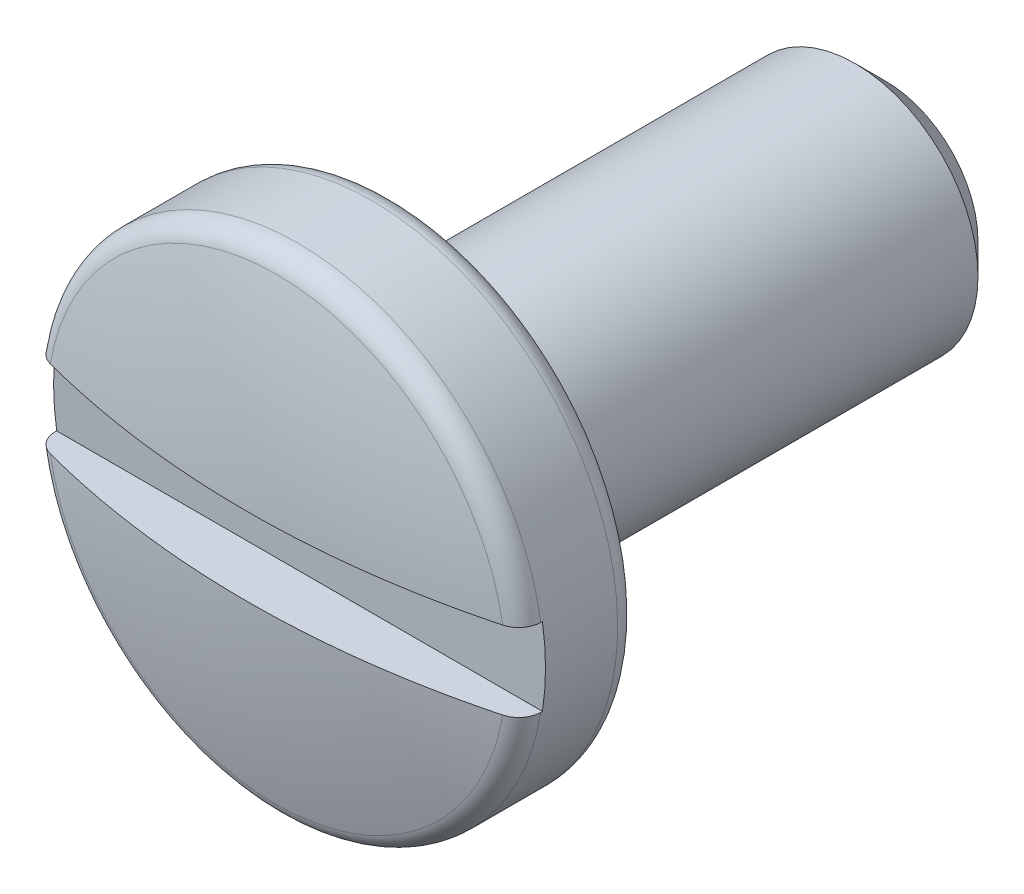
ISO-10303-21;
HEADER;
FILE_DESCRIPTION(('STEP AP214'),'2;1');
FILE_NAME('part.step','',(''),(''),'','','');
FILE_SCHEMA(('AUTOMOTIVE_DESIGN { 1 0 10303 214 1 1 1 1 }'));
ENDSEC;
DATA;
#1=APPLICATION_CONTEXT('core data for automotive mechanical design processes');
#2=APPLICATION_PROTOCOL_DEFINITION('international standard','automotive_design',2000,#1);
#3=PRODUCT_CONTEXT('',#1,'mechanical');
#4=PRODUCT('Part','Part','',(#3));
#5=PRODUCT_RELATED_PRODUCT_CATEGORY('part','',(#4));
#6=PRODUCT_DEFINITION_FORMATION('','',#4);
#7=PRODUCT_DEFINITION_CONTEXT('part definition',#1,'design');
#8=PRODUCT_DEFINITION('design','',#6,#7);
#9=PRODUCT_DEFINITION_SHAPE('','',#8);
#10=(LENGTH_UNIT() NAMED_UNIT(*) SI_UNIT(.MILLI.,.METRE.));
#11=(NAMED_UNIT(*) PLANE_ANGLE_UNIT() SI_UNIT($,.RADIAN.));
#12=(NAMED_UNIT(*) SI_UNIT($,.STERADIAN.) SOLID_ANGLE_UNIT());
#13=UNCERTAINTY_MEASURE_WITH_UNIT(LENGTH_MEASURE(1.E-05),#10,'distance_accuracy_value','');
#14=(GEOMETRIC_REPRESENTATION_CONTEXT(3) GLOBAL_UNCERTAINTY_ASSIGNED_CONTEXT((#13)) GLOBAL_UNIT_ASSIGNED_CONTEXT((#10,
#11,#12)) REPRESENTATION_CONTEXT('',''));
#15=CARTESIAN_POINT('',(0.,0.,0.));
#16=DIRECTION('',(0.,0.,1.));
#17=DIRECTION('',(1.,0.,0.));
#18=AXIS2_PLACEMENT_3D('',#15,#16,#17);
#19=CARTESIAN_POINT('',(0.,0.,-6.00250000000007));
#20=DIRECTION('',(0.,0.,1.));
#21=DIRECTION('',(0.,-1.,0.));
#22=AXIS2_PLACEMENT_3D('',#19,#20,#21);
#23=SPHERICAL_SURFACE('',#22,21.6025000000001);
#24=CARTESIAN_POINT('',(0.,0.,14.861540652819));
#25=DIRECTION('',(0.,0.,1.));
#26=DIRECTION('',(0.,-1.,0.));
#27=AXIS2_PLACEMENT_3D('',#24,#25,#26);
#28=CIRCLE('',#27,5.59998338278931);
#29=CARTESIAN_POINT('',(5.51881453643049,0.95,14.861540652819));
#30=VERTEX_POINT('',#29);
#31=CARTESIAN_POINT('',(-5.51881453643048,0.95,14.861540652819));
#32=VERTEX_POINT('',#31);
#33=EDGE_CURVE('E167',#30,#32,#28,.T.);
#34=ORIENTED_EDGE('',*,*,#33,.T.);
#35=CARTESIAN_POINT('',(0.,0.95,-6.00250000000007));
#36=DIRECTION('',(0.,-1.,0.));
#37=DIRECTION('',(0.,0.,-1.));
#38=AXIS2_PLACEMENT_3D('',#35,#36,#37);
#39=CIRCLE('',#38,21.5816011048764);
#40=EDGE_CURVE('E100',#32,#30,#39,.F.);
#41=ORIENTED_EDGE('',*,*,#40,.T.);
#42=EDGE_LOOP('',(#34,#41));
#43=FACE_BOUND('',#42,.T.);
#44=ADVANCED_FACE('F33',(#43),#23,.T.);
#45=CARTESIAN_POINT('',(0.,0.,14.34));
#46=DIRECTION('',(0.,0.,1.));
#47=DIRECTION('',(0.,-1.,0.));
#48=AXIS2_PLACEMENT_3D('',#45,#46,#47);
#49=TOROIDAL_SURFACE('',#48,5.46,0.540000000000001);
#50=CARTESIAN_POINT('',(0.,0.,14.34));
#51=DIRECTION('',(0.,0.,1.));
#52=DIRECTION('',(0.,-1.,0.));
#53=AXIS2_PLACEMENT_3D('',#50,#51,#52);
#54=CIRCLE('',#53,6.);
#55=CARTESIAN_POINT('',(5.92431430631427,0.95,14.34));
#56=VERTEX_POINT('',#55);
#57=CARTESIAN_POINT('',(-5.92431430631428,0.95,14.34));
#58=VERTEX_POINT('',#57);
#59=EDGE_CURVE('E168',#56,#58,#54,.T.);
#60=ORIENTED_EDGE('',*,*,#59,.T.);
#61=CARTESIAN_POINT('',(-5.91408286412616,0.95,14.4439628781724));
#62=CARTESIAN_POINT('',(-5.90820099303262,0.95,14.4735559619081));
#63=CARTESIAN_POINT('',(-5.89979982613832,0.95,14.5026716036783));
#64=CARTESIAN_POINT('',(-5.8782065755902,0.95,14.5590962525339));
#65=CARTESIAN_POINT('',(-5.86500844927302,0.95,14.5864029293704));
#66=CARTESIAN_POINT('',(-5.83423312672482,0.95,14.6383948618619));
#67=CARTESIAN_POINT('',(-5.81665980630227,0.95,14.6630824102392));
#68=CARTESIAN_POINT('',(-5.77765260619428,0.95,14.7091776283677));
#69=CARTESIAN_POINT('',(-5.75621962903431,0.95,14.7305860627317));
#70=CARTESIAN_POINT('',(-5.70992866520756,0.95,14.7697131225802));
#71=CARTESIAN_POINT('',(-5.68504535737676,0.95,14.7874017821034));
#72=CARTESIAN_POINT('',(-5.63269286804277,0.95,14.8184151157693));
#73=CARTESIAN_POINT('',(-5.60522341701303,0.95,14.8317393344025));
#74=CARTESIAN_POINT('',(-5.54808969919578,0.95,14.8538307575968));
#75=CARTESIAN_POINT('',(-5.5184011542488,0.95,14.8625351773436));
#76=CARTESIAN_POINT('',(-5.4579914035091,0.95,14.8748984498427));
#77=CARTESIAN_POINT('',(-5.4272701279018,0.95,14.8785569607765));
#78=CARTESIAN_POINT('',(-5.36529526973599,0.95,14.8807554342426));
#79=CARTESIAN_POINT('',(-5.3340396011594,0.95,14.8792368907672));
#80=CARTESIAN_POINT('',(-5.27222057901635,0.95,14.8709984356016));
#81=CARTESIAN_POINT('',(-5.2416572526272,0.95,14.8642783200911));
#82=CARTESIAN_POINT('',(-5.1819587754752,0.95,14.8457762849293));
#83=CARTESIAN_POINT('',(-5.15283025690264,0.95,14.8339729431793));
#84=CARTESIAN_POINT('',(-5.09698438114967,0.95,14.805614697295));
#85=CARTESIAN_POINT('',(-5.0702669899726,0.95,14.7890598601699));
#86=CARTESIAN_POINT('',(-5.02019106408889,0.95,14.7517603864982));
#87=CARTESIAN_POINT('',(-4.99681289206552,0.95,14.7310421301236));
#88=CARTESIAN_POINT('',(-4.95393276095446,0.95,14.6859204303722));
#89=CARTESIAN_POINT('',(-4.93443048835405,0.95,14.661517285339));
#90=CARTESIAN_POINT('',(-4.90018084305378,0.95,14.6101122701604));
#91=CARTESIAN_POINT('',(-4.88536552265442,0.95,14.5831556825057));
#92=CARTESIAN_POINT('',(-4.86056279684425,0.95,14.5271059276789));
#93=CARTESIAN_POINT('',(-4.8505748714092,0.95,14.4980129910311));
#94=CARTESIAN_POINT('',(-4.8358820737941,0.95,14.4390571359505));
#95=CARTESIAN_POINT('',(-4.83108890485606,0.95,14.4092162055842));
#96=CARTESIAN_POINT('',(-4.82663557671632,0.95,14.3491545309638));
#97=CARTESIAN_POINT('',(-4.82697505432434,0.95,14.3189338137349));
#98=CARTESIAN_POINT('',(-4.8327465883141,0.95,14.2592830478239));
#99=CARTESIAN_POINT('',(-4.83812878878605,0.95,14.2298481562619));
#100=CARTESIAN_POINT('',(-4.85374303707929,0.95,14.1722953960671));
#101=CARTESIAN_POINT('',(-4.86397509678908,0.95,14.1441775306628));
#102=CARTESIAN_POINT('',(-4.88901291697735,0.95,14.0899465312197));
#103=CARTESIAN_POINT('',(-4.90383371682446,0.95,14.0638403469928));
#104=CARTESIAN_POINT('',(-4.93758916249785,0.95,14.0144402874773));
#105=CARTESIAN_POINT('',(-4.95652407720675,0.95,13.9911465961573));
#106=CARTESIAN_POINT('',(-4.99825261015565,0.95,13.9476717167146));
#107=CARTESIAN_POINT('',(-5.0210974645698,0.95,13.9275397195313));
#108=CARTESIAN_POINT('',(-5.06979338632466,0.95,13.8913179656327));
#109=CARTESIAN_POINT('',(-5.09564472894964,0.95,13.8752285794995));
#110=CARTESIAN_POINT('',(-5.1501014615364,0.95,13.8472601379013));
#111=CARTESIAN_POINT('',(-5.17874680273083,0.95,13.8354588474951));
#112=CARTESIAN_POINT('',(-5.2375978308741,0.95,13.8167684193339));
#113=CARTESIAN_POINT('',(-5.26780363053907,0.95,13.809879636956));
#114=CARTESIAN_POINT('',(-5.32930286894649,0.95,13.8011435424912));
#115=CARTESIAN_POINT('',(-5.36060496048082,0.95,13.7993570210726));
#116=CARTESIAN_POINT('',(-5.42306698938116,0.95,13.8010535073426));
#117=CARTESIAN_POINT('',(-5.45422692295463,0.95,13.804536654803));
#118=CARTESIAN_POINT('',(-5.51557345643747,0.95,13.8167014190185));
#119=CARTESIAN_POINT('',(-5.54575825113229,0.95,13.8253921533435));
#120=CARTESIAN_POINT('',(-5.60422269400551,0.95,13.8477569869247));
#121=CARTESIAN_POINT('',(-5.63250239796535,0.95,13.861430940196));
#122=CARTESIAN_POINT('',(-5.68611244563843,0.95,13.8932719762133));
#123=CARTESIAN_POINT('',(-5.7114639300382,0.95,13.911403450211));
#124=CARTESIAN_POINT('',(-5.75871098077637,0.95,13.9517161501393));
#125=CARTESIAN_POINT('',(-5.78060691632715,0.95,13.9738969428685));
#126=CARTESIAN_POINT('',(-5.82001681999505,0.95,14.0213700398175));
#127=CARTESIAN_POINT('',(-5.83758418847429,0.95,14.0466180149942));
#128=CARTESIAN_POINT('',(-5.86817152106584,0.95,14.099742420399));
#129=CARTESIAN_POINT('',(-5.88119065975126,0.95,14.127619326569));
#130=CARTESIAN_POINT('',(-5.90214457522207,0.95,14.1848356566686));
#131=CARTESIAN_POINT('',(-5.91013905899079,0.95,14.2141532612866));
#132=CARTESIAN_POINT('',(-5.92103777836602,0.95,14.2736938653031));
#133=CARTESIAN_POINT('',(-5.92394856695173,0.95,14.3039156479816));
#134=CARTESIAN_POINT('',(-5.92448539799561,0.95,14.3525621580073));
#135=CARTESIAN_POINT('',(-5.92373161691234,0.95,14.3709837356399));
#136=CARTESIAN_POINT('',(-5.9203258485621,0.95,14.4076504875292));
#137=CARTESIAN_POINT('',(-5.9176738731696,0.95,14.4258956628888));
#138=CARTESIAN_POINT('',(-5.91408286412616,0.95,14.4439628781724));
#139=B_SPLINE_CURVE_WITH_KNOTS('',3,(#61,#62,#63,#64,#65,#66,#67,#68,#69,#70,#71,#72,#73,#74,
#75,#76,#77,#78,#79,#80,#81,#82,#83,#84,#85,#86,#87,#88,#89,#90,#91,#92,#93,#94,#95,#96,#97,#98,
#99,#100,#101,#102,#103,#104,#105,#106,#107,#108,#109,#110,#111,#112,#113,#114,#115,#116,#117,
#118,#119,#120,#121,#122,#123,#124,#125,#126,#127,#128,#129,#130,#131,#132,#133,#134,#135,#136,
#137,#138),.UNSPECIFIED.,.T.,.F.,(4,2,2,2,2,2,2,2,2,2,2,2,2,2,2,2,2,2,2,2,2,2,2,2,2,2,2,2,2,2,2,
2,2,2,2,2,2,2,4),(0.,0.0904478792539783,0.181010091588253,0.271492362188787,0.36195350221476,
0.453117607544997,0.544291224492355,0.636674101462678,0.729063236301224,0.822499907634658,
0.915940240413774,1.00977826991165,1.10361497609572,1.19687486931934,1.29012721588842,
1.38195811481368,1.47377911918018,1.56401368017409,1.65424185612642,1.74358728168259,
1.83293292625282,1.92257455320903,2.01222204055844,2.10314956069556,2.19408541302963,
2.28659657185072,2.37911442237007,2.4727300653122,2.56634819134221,2.66013070715836,
2.75391047580851,2.84696413486097,2.94000784473918,3.03183868635747,3.12368618507576,
3.21442055074415,3.3050378715385,3.36025859620656,3.4154789754354),.UNSPECIFIED.);
#140=EDGE_CURVE('E90',#58,#32,#139,.T.);
#141=ORIENTED_EDGE('',*,*,#140,.T.);
#142=ORIENTED_EDGE('',*,*,#33,.F.);
#143=CARTESIAN_POINT('',(4.83682440513329,0.95,14.4394478551972));
#144=CARTESIAN_POINT('',(4.84247640495268,0.95,14.4690397947303));
#145=CARTESIAN_POINT('',(4.85065773668445,0.95,14.4981723132612));
#146=CARTESIAN_POINT('',(4.87182544709717,0.95,14.5546636895985));
#147=CARTESIAN_POINT('',(4.88481809030107,0.95,14.5820201801213));
#148=CARTESIAN_POINT('',(4.91518464569733,0.95,14.6341421336857));
#149=CARTESIAN_POINT('',(4.9325536263659,0.95,14.658910469068));
#150=CARTESIAN_POINT('',(4.97115203822448,0.95,14.7052157356956));
#151=CARTESIAN_POINT('',(4.99238062016714,0.95,14.7267533759081));
#152=CARTESIAN_POINT('',(5.03836062806902,0.95,14.7662808174436));
#153=CARTESIAN_POINT('',(5.06315103037017,0.95,14.7842252678716));
#154=CARTESIAN_POINT('',(5.11535358683606,0.95,14.8157784710163));
#155=CARTESIAN_POINT('',(5.14276606827431,0.95,14.8293866815867));
#156=CARTESIAN_POINT('',(5.1999218862093,0.95,14.8521070615309));
#157=CARTESIAN_POINT('',(5.2296962658606,0.95,14.8611411779848));
#158=CARTESIAN_POINT('',(5.29033308252579,0.95,14.8741340221093));
#159=CARTESIAN_POINT('',(5.32119558621155,0.95,14.8780924382228));
#160=CARTESIAN_POINT('',(5.38343541099762,0.95,14.8808378254908));
#161=CARTESIAN_POINT('',(5.41481485688069,0.95,14.8795769505175));
#162=CARTESIAN_POINT('',(5.47691636321346,0.95,14.8717990215925));
#163=CARTESIAN_POINT('',(5.50763842004573,0.95,14.8652819387249));
#164=CARTESIAN_POINT('',(5.56750499330759,0.95,14.8471664000118));
#165=CARTESIAN_POINT('',(5.59665145907805,0.95,14.8355743924385));
#166=CARTESIAN_POINT('',(5.65255697421994,0.95,14.8076144350991));
#167=CARTESIAN_POINT('',(5.6793161260906,0.95,14.7912466905082));
#168=CARTESIAN_POINT('',(5.72940067596725,0.95,14.7543638564202));
#169=CARTESIAN_POINT('',(5.752757165969,0.95,14.7338909999974));
#170=CARTESIAN_POINT('',(5.79564355464877,0.95,14.6892668427131));
#171=CARTESIAN_POINT('',(5.81517373236117,0.95,14.6651158103117));
#172=CARTESIAN_POINT('',(5.84957544407563,0.95,14.6141680689685));
#173=CARTESIAN_POINT('',(5.86450584333343,0.95,14.5874111058719));
#174=CARTESIAN_POINT('',(5.88960166131369,0.95,14.5317487363972));
#175=CARTESIAN_POINT('',(5.89976741183367,0.95,14.502843479783));
#176=CARTESIAN_POINT('',(5.9149306494783,0.95,14.4440659967135));
#177=CARTESIAN_POINT('',(5.91998668663484,0.95,14.4142088653396));
#178=CARTESIAN_POINT('',(5.92498174995559,0.95,14.3540700155856));
#179=CARTESIAN_POINT('',(5.92492099455564,0.95,14.3237883153856));
#180=CARTESIAN_POINT('',(5.91970016802833,0.95,14.2638469794583));
#181=CARTESIAN_POINT('',(5.91456986751707,0.95,14.2341847442534));
#182=CARTESIAN_POINT('',(5.8994098993757,0.95,14.1761407131891));
#183=CARTESIAN_POINT('',(5.88938024963987,0.95,14.1477589126534));
#184=CARTESIAN_POINT('',(5.86470169496997,0.95,14.0930245555649));
#185=CARTESIAN_POINT('',(5.8500451453356,0.95,14.0666754477915));
#186=CARTESIAN_POINT('',(5.81655205453034,0.95,14.0167844847025));
#187=CARTESIAN_POINT('',(5.7977153690247,0.95,13.9932427263641));
#188=CARTESIAN_POINT('',(5.75623097598951,0.95,13.9494125612447));
#189=CARTESIAN_POINT('',(5.73355197836509,0.95,13.9291537784371));
#190=CARTESIAN_POINT('',(5.68515161899892,0.95,13.8926739200537));
#191=CARTESIAN_POINT('',(5.6594300660855,0.95,13.8764530983927));
#192=CARTESIAN_POINT('',(5.60532446141866,0.95,13.8482877360382));
#193=CARTESIAN_POINT('',(5.57691058866195,0.95,13.836400484607));
#194=CARTESIAN_POINT('',(5.51850622385522,0.95,13.8174980950864));
#195=CARTESIAN_POINT('',(5.4885156213502,0.95,13.8104832988186));
#196=CARTESIAN_POINT('',(5.42740580800129,0.95,13.8014406002523));
#197=CARTESIAN_POINT('',(5.39627714955243,0.95,13.7994764869019));
#198=CARTESIAN_POINT('',(5.33412693431079,0.95,13.8007616903196));
#199=CARTESIAN_POINT('',(5.3031053836171,0.95,13.8040112992239));
#200=CARTESIAN_POINT('',(5.24181820260555,0.95,13.8156756410718));
#201=CARTESIAN_POINT('',(5.21155954250446,0.95,13.8241270509503));
#202=CARTESIAN_POINT('',(5.15289466666525,0.95,13.8460018099041));
#203=CARTESIAN_POINT('',(5.12448846488054,0.95,13.8594251964252));
#204=CARTESIAN_POINT('',(5.07042388430418,0.95,13.8908463229353));
#205=CARTESIAN_POINT('',(5.04475876028335,0.95,13.9088324483385));
#206=CARTESIAN_POINT('',(4.99686243676178,0.95,13.948908901845));
#207=CARTESIAN_POINT('',(4.97463089574783,0.95,13.9709988212919));
#208=CARTESIAN_POINT('',(4.93454759286052,0.95,14.0183613870703));
#209=CARTESIAN_POINT('',(4.91664327951233,0.95,14.0435895446884));
#210=CARTESIAN_POINT('',(4.88540928894486,0.95,14.0967446176961));
#211=CARTESIAN_POINT('',(4.87208030486004,0.95,14.1246719411722));
#212=CARTESIAN_POINT('',(4.85062218682697,0.95,14.1819070861569));
#213=CARTESIAN_POINT('',(4.842407712262,0.95,14.2111829768688));
#214=CARTESIAN_POINT('',(4.83109636184015,0.95,14.2706807910826));
#215=CARTESIAN_POINT('',(4.82799262241727,0.95,14.3009013901637));
#216=CARTESIAN_POINT('',(4.82718087398153,0.95,14.3492945017202));
#217=CARTESIAN_POINT('',(4.82781207376359,0.95,14.3674547074061));
#218=CARTESIAN_POINT('',(4.83093080938027,0.95,14.4036148413034));
#219=CARTESIAN_POINT('',(4.83341832267764,0.95,14.4216147714581));
#220=CARTESIAN_POINT('',(4.83682440513329,0.95,14.4394478551972));
#221=B_SPLINE_CURVE_WITH_KNOTS('',3,(#143,#144,#145,#146,#147,#148,#149,#150,#151,#152,#153,
#154,#155,#156,#157,#158,#159,#160,#161,#162,#163,#164,#165,#166,#167,#168,#169,#170,#171,#172,
#173,#174,#175,#176,#177,#178,#179,#180,#181,#182,#183,#184,#185,#186,#187,#188,#189,#190,#191,
#192,#193,#194,#195,#196,#197,#198,#199,#200,#201,#202,#203,#204,#205,#206,#207,#208,#209,#210,
#211,#212,#213,#214,#215,#216,#217,#218,#219,#220),.UNSPECIFIED.,.T.,.F.,(4,2,2,2,2,2,2,2,2,2,2,
2,2,2,2,2,2,2,2,2,2,2,2,2,2,2,2,2,2,2,2,2,2,2,2,2,2,2,4),(0.,0.0903131250714283,
0.180744257346397,0.27107393852658,0.36138376801719,0.452770100675054,0.544167854594141,
0.637076691301503,0.729991230676079,0.823759410804649,0.917528106781145,1.01117800313762,
1.10482387670278,1.19755166157004,1.29027268173086,1.38175244491998,1.47322583675384,
1.56363876629347,1.65404783610758,1.74392912010497,1.83381007582467,1.92384031966508,
2.01387367261838,2.10467894939972,2.19548993474665,2.28746127290161,2.37943906255185,
2.47257292962511,2.56571201537504,2.65951545211125,2.75331959532831,2.8468873122732,
2.94044571672532,3.03280331448307,3.1251748976848,3.21596068104943,3.30662444205956,
3.36105078589094,3.4154764689502),.UNSPECIFIED.);
#222=EDGE_CURVE('E183',#30,#56,#221,.T.);
#223=ORIENTED_EDGE('',*,*,#222,.T.);
#224=EDGE_LOOP('',(#60,#141,#142,#223));
#225=FACE_BOUND('',#224,.T.);
#226=ADVANCED_FACE('F145',(#225),#49,.T.);
#227=CARTESIAN_POINT('',(0.,0.,12.));
#228=DIRECTION('',(0.,0.,-1.));
#229=DIRECTION('',(-1.,0.,0.));
#230=AXIS2_PLACEMENT_3D('',#227,#228,#229);
#231=PLANE('',#230);
#232=CARTESIAN_POINT('',(0.,0.,12.));
#233=DIRECTION('',(0.,0.,1.));
#234=DIRECTION('',(1.,0.,0.));
#235=AXIS2_PLACEMENT_3D('',#232,#233,#234);
#236=CIRCLE('',#235,3.);
#237=CARTESIAN_POINT('',(3.,0.,12.));
#238=VERTEX_POINT('',#237);
#239=EDGE_CURVE('E170',#238,#238,#236,.T.);
#240=ORIENTED_EDGE('',*,*,#239,.T.);
#241=EDGE_LOOP('',(#240));
#242=FACE_BOUND('',#241,.T.);
#243=CARTESIAN_POINT('',(0.,0.,12.));
#244=DIRECTION('',(0.,0.,1.));
#245=DIRECTION('',(0.,-1.,0.));
#246=AXIS2_PLACEMENT_3D('',#243,#244,#245);
#247=CIRCLE('',#246,5.46);
#248=CARTESIAN_POINT('',(0.,-5.46,12.));
#249=VERTEX_POINT('',#248);
#250=EDGE_CURVE('E199',#249,#249,#247,.T.);
#251=ORIENTED_EDGE('',*,*,#250,.F.);
#252=EDGE_LOOP('',(#251));
#253=FACE_BOUND('',#252,.T.);
#254=ADVANCED_FACE('F150',(#242,#253),#231,.T.);
#255=CARTESIAN_POINT('',(0.,0.,0.));
#256=DIRECTION('',(0.,0.,1.));
#257=DIRECTION('',(1.,0.,0.));
#258=AXIS2_PLACEMENT_3D('',#255,#256,#257);
#259=PLANE('',#258);
#260=CARTESIAN_POINT('',(0.,0.,0.));
#261=DIRECTION('',(0.,0.,1.));
#262=DIRECTION('',(1.,0.,0.));
#263=AXIS2_PLACEMENT_3D('',#260,#261,#262);
#264=CIRCLE('',#263,2.25);
#265=CARTESIAN_POINT('',(2.25,0.,0.));
#266=VERTEX_POINT('',#265);
#267=EDGE_CURVE('E180',#266,#266,#264,.F.);
#268=ORIENTED_EDGE('',*,*,#267,.T.);
#269=EDGE_LOOP('',(#268));
#270=FACE_BOUND('',#269,.T.);
#271=ADVANCED_FACE('F206',(#270),#259,.F.);
#272=CARTESIAN_POINT('',(0.,0.,0.));
#273=DIRECTION('',(0.,0.,1.));
#274=DIRECTION('',(1.,0.,0.));
#275=AXIS2_PLACEMENT_3D('',#272,#273,#274);
#276=CYLINDRICAL_SURFACE('',#275,3.);
#277=CARTESIAN_POINT('',(0.,0.,0.749999999999997));
#278=DIRECTION('',(0.,0.,1.));
#279=DIRECTION('',(1.,0.,0.));
#280=AXIS2_PLACEMENT_3D('',#277,#278,#279);
#281=CIRCLE('',#280,3.);
#282=CARTESIAN_POINT('',(3.,0.,0.749999999999997));
#283=VERTEX_POINT('',#282);
#284=EDGE_CURVE('E177',#283,#283,#281,.T.);
#285=ORIENTED_EDGE('',*,*,#284,.T.);
#286=EDGE_LOOP('',(#285));
#287=FACE_BOUND('',#286,.T.);
#288=ORIENTED_EDGE('',*,*,#239,.F.);
#289=EDGE_LOOP('',(#288));
#290=FACE_BOUND('',#289,.T.);
#291=ADVANCED_FACE('F140',(#287,#290),#276,.T.);
#292=CARTESIAN_POINT('',(0.,0.,0.749999999999997));
#293=DIRECTION('',(0.,0.,1.));
#294=DIRECTION('',(1.,0.,0.));
#295=AXIS2_PLACEMENT_3D('',#292,#293,#294);
#296=CONICAL_SURFACE('',#295,3.,0.785398163397451);
#297=ORIENTED_EDGE('',*,*,#267,.F.);
#298=EDGE_LOOP('',(#297));
#299=FACE_BOUND('',#298,.T.);
#300=ORIENTED_EDGE('',*,*,#284,.F.);
#301=EDGE_LOOP('',(#300));
#302=FACE_BOUND('',#301,.T.);
#303=ADVANCED_FACE('F35',(#299,#302),#296,.T.);
#304=CARTESIAN_POINT('',(0.,0.,12.54));
#305=DIRECTION('',(0.,0.,1.));
#306=DIRECTION('',(0.,-1.,0.));
#307=AXIS2_PLACEMENT_3D('',#304,#305,#306);
#308=TOROIDAL_SURFACE('',#307,5.46,0.540000000000001);
#309=ORIENTED_EDGE('',*,*,#250,.T.);
#310=EDGE_LOOP('',(#309));
#311=FACE_BOUND('',#310,.T.);
#312=CARTESIAN_POINT('',(0.,0.,12.54));
#313=DIRECTION('',(0.,0.,1.));
#314=DIRECTION('',(0.,-1.,0.));
#315=AXIS2_PLACEMENT_3D('',#312,#313,#314);
#316=CIRCLE('',#315,6.);
#317=CARTESIAN_POINT('',(0.,-6.,12.54));
#318=VERTEX_POINT('',#317);
#319=EDGE_CURVE('E200',#318,#318,#316,.T.);
#320=ORIENTED_EDGE('',*,*,#319,.F.);
#321=EDGE_LOOP('',(#320));
#322=FACE_BOUND('',#321,.T.);
#323=ADVANCED_FACE('F130',(#311,#322),#308,.T.);
#324=CARTESIAN_POINT('',(0.,0.,0.));
#325=DIRECTION('',(0.,0.,-1.));
#326=DIRECTION('',(-1.,0.,0.));
#327=AXIS2_PLACEMENT_3D('',#324,#325,#326);
#328=CYLINDRICAL_SURFACE('',#327,6.);
#329=DIRECTION('',(0.,0.,-1.));
#330=VECTOR('',#329,1.);
#331=CARTESIAN_POINT('',(5.92431430631427,-0.95,0.));
#332=LINE('',#331,#330);
#333=CARTESIAN_POINT('',(5.92431430631467,-0.95,14.34));
#334=VERTEX_POINT('',#333);
#335=CARTESIAN_POINT('',(5.92431430631427,-0.95,14.3));
#336=VERTEX_POINT('',#335);
#337=EDGE_CURVE('E164',#334,#336,#332,.T.);
#338=ORIENTED_EDGE('',*,*,#337,.F.);
#339=CARTESIAN_POINT('',(-5.92431430631428,-0.95,14.34));
#340=VERTEX_POINT('',#339);
#341=EDGE_CURVE('E171',#340,#334,#54,.T.);
#342=ORIENTED_EDGE('',*,*,#341,.F.);
#343=DIRECTION('',(0.,0.,-1.));
#344=VECTOR('',#343,1.);
#345=CARTESIAN_POINT('',(-5.92431430631427,-0.95,0.));
#346=LINE('',#345,#344);
#347=CARTESIAN_POINT('',(-5.92431430631427,-0.95,14.3));
#348=VERTEX_POINT('',#347);
#349=EDGE_CURVE('E56',#348,#340,#346,.F.);
#350=ORIENTED_EDGE('',*,*,#349,.F.);
#351=CARTESIAN_POINT('',(0.,0.,14.3));
#352=DIRECTION('',(0.,0.,-1.));
#353=DIRECTION('',(-1.,0.,0.));
#354=AXIS2_PLACEMENT_3D('',#351,#352,#353);
#355=CIRCLE('',#354,6.);
#356=CARTESIAN_POINT('',(-5.92431430631427,0.95,14.3));
#357=VERTEX_POINT('',#356);
#358=EDGE_CURVE('E37',#357,#348,#355,.F.);
#359=ORIENTED_EDGE('',*,*,#358,.F.);
#360=DIRECTION('',(0.,0.,-1.));
#361=VECTOR('',#360,1.);
#362=CARTESIAN_POINT('',(-5.92431430631427,0.95,0.));
#363=LINE('',#362,#361);
#364=EDGE_CURVE('E85',#357,#58,#363,.F.);
#365=ORIENTED_EDGE('',*,*,#364,.T.);
#366=ORIENTED_EDGE('',*,*,#59,.F.);
#367=DIRECTION('',(0.,0.,-1.));
#368=VECTOR('',#367,1.);
#369=CARTESIAN_POINT('',(5.92431430631427,0.95,0.));
#370=LINE('',#369,#368);
#371=CARTESIAN_POINT('',(5.92431430631427,0.95,14.3));
#372=VERTEX_POINT('',#371);
#373=EDGE_CURVE('E48',#56,#372,#370,.T.);
#374=ORIENTED_EDGE('',*,*,#373,.T.);
#375=EDGE_CURVE('E11',#336,#372,#355,.F.);
#376=ORIENTED_EDGE('',*,*,#375,.F.);
#377=EDGE_LOOP('',(#338,#342,#350,#359,#365,#366,#374,#376));
#378=FACE_BOUND('',#377,.T.);
#379=ORIENTED_EDGE('',*,*,#319,.T.);
#380=EDGE_LOOP('',(#379));
#381=FACE_BOUND('',#380,.T.);
#382=ADVANCED_FACE('F104',(#378,#381),#328,.T.);
#383=CARTESIAN_POINT('',(0.,-0.95,-6.00250000000007));
#384=DIRECTION('',(0.,-1.,0.));
#385=DIRECTION('',(0.,0.,-1.));
#386=AXIS2_PLACEMENT_3D('',#383,#384,#385);
#387=CIRCLE('',#386,21.5816011048764);
#388=CARTESIAN_POINT('',(-5.51881453643048,-0.95,14.861540652819));
#389=VERTEX_POINT('',#388);
#390=CARTESIAN_POINT('',(5.51881453643049,-0.95,14.861540652819));
#391=VERTEX_POINT('',#390);
#392=EDGE_CURVE('E95',#389,#391,#387,.F.);
#393=ORIENTED_EDGE('',*,*,#392,.F.);
#394=EDGE_CURVE('E162',#389,#391,#28,.T.);
#395=ORIENTED_EDGE('',*,*,#394,.T.);
#396=EDGE_LOOP('',(#393,#395));
#397=FACE_BOUND('',#396,.T.);
#398=ADVANCED_FACE('F138',(#397),#23,.T.);
#399=CARTESIAN_POINT('',(-5.91408286412616,-0.95,14.4439628781724));
#400=CARTESIAN_POINT('',(-5.90820099303262,-0.95,14.4735559619081));
#401=CARTESIAN_POINT('',(-5.89979982613832,-0.95,14.5026716036783));
#402=CARTESIAN_POINT('',(-5.8782065755902,-0.95,14.5590962525339));
#403=CARTESIAN_POINT('',(-5.86500844927302,-0.95,14.5864029293704));
#404=CARTESIAN_POINT('',(-5.83423312672482,-0.95,14.6383948618619));
#405=CARTESIAN_POINT('',(-5.81665980630227,-0.95,14.6630824102392));
#406=CARTESIAN_POINT('',(-5.77765260619428,-0.95,14.7091776283677));
#407=CARTESIAN_POINT('',(-5.75621962903431,-0.95,14.7305860627317));
#408=CARTESIAN_POINT('',(-5.70992866520756,-0.95,14.7697131225802));
#409=CARTESIAN_POINT('',(-5.68504535737676,-0.95,14.7874017821034));
#410=CARTESIAN_POINT('',(-5.63269286804277,-0.95,14.8184151157693));
#411=CARTESIAN_POINT('',(-5.60522341701304,-0.95,14.8317393344025));
#412=CARTESIAN_POINT('',(-5.54808969919578,-0.95,14.8538307575968));
#413=CARTESIAN_POINT('',(-5.5184011542488,-0.95,14.8625351773436));
#414=CARTESIAN_POINT('',(-5.4579914035091,-0.95,14.8748984498427));
#415=CARTESIAN_POINT('',(-5.42727012790181,-0.95,14.8785569607765));
#416=CARTESIAN_POINT('',(-5.365295269736,-0.95,14.8807554342426));
#417=CARTESIAN_POINT('',(-5.3340396011594,-0.95,14.8792368907672));
#418=CARTESIAN_POINT('',(-5.27222057901635,-0.95,14.8709984356016));
#419=CARTESIAN_POINT('',(-5.2416572526272,-0.95,14.8642783200911));
#420=CARTESIAN_POINT('',(-5.1819587754752,-0.95,14.8457762849293));
#421=CARTESIAN_POINT('',(-5.15283025690264,-0.95,14.8339729431793));
#422=CARTESIAN_POINT('',(-5.09698438114967,-0.95,14.805614697295));
#423=CARTESIAN_POINT('',(-5.0702669899726,-0.95,14.7890598601699));
#424=CARTESIAN_POINT('',(-5.02019106408889,-0.95,14.7517603864982));
#425=CARTESIAN_POINT('',(-4.99681289206552,-0.95,14.7310421301236));
#426=CARTESIAN_POINT('',(-4.95393276095446,-0.95,14.6859204303722));
#427=CARTESIAN_POINT('',(-4.93443048835405,-0.95,14.661517285339));
#428=CARTESIAN_POINT('',(-4.90018084305378,-0.95,14.6101122701604));
#429=CARTESIAN_POINT('',(-4.88536552265442,-0.95,14.5831556825057));
#430=CARTESIAN_POINT('',(-4.86056279684425,-0.95,14.5271059276789));
#431=CARTESIAN_POINT('',(-4.8505748714092,-0.95,14.4980129910312));
#432=CARTESIAN_POINT('',(-4.8358820737941,-0.95,14.4390571359505));
#433=CARTESIAN_POINT('',(-4.83108890485606,-0.95,14.4092162055842));
#434=CARTESIAN_POINT('',(-4.82663557671632,-0.95,14.3491545309638));
#435=CARTESIAN_POINT('',(-4.82697505432434,-0.95,14.3189338137349));
#436=CARTESIAN_POINT('',(-4.8327465883141,-0.95,14.2592830478239));
#437=CARTESIAN_POINT('',(-4.83812878878605,-0.95,14.2298481562619));
#438=CARTESIAN_POINT('',(-4.85374303707929,-0.95,14.1722953960671));
#439=CARTESIAN_POINT('',(-4.86397509678908,-0.95,14.1441775306628));
#440=CARTESIAN_POINT('',(-4.88901291697735,-0.95,14.0899465312197));
#441=CARTESIAN_POINT('',(-4.90383371682447,-0.95,14.0638403469928));
#442=CARTESIAN_POINT('',(-4.93758916249785,-0.95,14.0144402874773));
#443=CARTESIAN_POINT('',(-4.95652407720676,-0.95,13.9911465961573));
#444=CARTESIAN_POINT('',(-4.99825261015565,-0.95,13.9476717167146));
#445=CARTESIAN_POINT('',(-5.0210974645698,-0.95,13.9275397195313));
#446=CARTESIAN_POINT('',(-5.06979338632466,-0.95,13.8913179656327));
#447=CARTESIAN_POINT('',(-5.09564472894964,-0.95,13.8752285794995));
#448=CARTESIAN_POINT('',(-5.1501014615364,-0.95,13.8472601379013));
#449=CARTESIAN_POINT('',(-5.17874680273083,-0.95,13.8354588474951));
#450=CARTESIAN_POINT('',(-5.2375978308741,-0.95,13.8167684193339));
#451=CARTESIAN_POINT('',(-5.26780363053907,-0.95,13.809879636956));
#452=CARTESIAN_POINT('',(-5.32930286894649,-0.95,13.8011435424912));
#453=CARTESIAN_POINT('',(-5.36060496048082,-0.95,13.7993570210726));
#454=CARTESIAN_POINT('',(-5.42306698938116,-0.95,13.8010535073426));
#455=CARTESIAN_POINT('',(-5.45422692295463,-0.95,13.804536654803));
#456=CARTESIAN_POINT('',(-5.51557345643747,-0.95,13.8167014190185));
#457=CARTESIAN_POINT('',(-5.54575825113229,-0.95,13.8253921533435));
#458=CARTESIAN_POINT('',(-5.6042226940055,-0.95,13.8477569869247));
#459=CARTESIAN_POINT('',(-5.63250239796535,-0.95,13.861430940196));
#460=CARTESIAN_POINT('',(-5.68611244563843,-0.95,13.8932719762133));
#461=CARTESIAN_POINT('',(-5.7114639300382,-0.95,13.911403450211));
#462=CARTESIAN_POINT('',(-5.75871098077637,-0.95,13.9517161501393));
#463=CARTESIAN_POINT('',(-5.78060691632715,-0.95,13.9738969428685));
#464=CARTESIAN_POINT('',(-5.82001681999505,-0.95,14.0213700398175));
#465=CARTESIAN_POINT('',(-5.83758418847428,-0.95,14.0466180149942));
#466=CARTESIAN_POINT('',(-5.86817152106584,-0.95,14.099742420399));
#467=CARTESIAN_POINT('',(-5.88119065975125,-0.95,14.127619326569));
#468=CARTESIAN_POINT('',(-5.90214457522207,-0.95,14.1848356566686));
#469=CARTESIAN_POINT('',(-5.91013905899079,-0.95,14.2141532612866));
#470=CARTESIAN_POINT('',(-5.92103777836602,-0.95,14.2736938653031));
#471=CARTESIAN_POINT('',(-5.92394856695173,-0.95,14.3039156479816));
#472=CARTESIAN_POINT('',(-5.92448539799561,-0.95,14.3525621580073));
#473=CARTESIAN_POINT('',(-5.92373161691234,-0.95,14.3709837356399));
#474=CARTESIAN_POINT('',(-5.9203258485621,-0.95,14.4076504875292));
#475=CARTESIAN_POINT('',(-5.9176738731696,-0.95,14.4258956628888));
#476=CARTESIAN_POINT('',(-5.91408286412616,-0.95,14.4439628781724));
#477=B_SPLINE_CURVE_WITH_KNOTS('',3,(#399,#400,#401,#402,#403,#404,#405,#406,#407,#408,#409,
#410,#411,#412,#413,#414,#415,#416,#417,#418,#419,#420,#421,#422,#423,#424,#425,#426,#427,#428,
#429,#430,#431,#432,#433,#434,#435,#436,#437,#438,#439,#440,#441,#442,#443,#444,#445,#446,#447,
#448,#449,#450,#451,#452,#453,#454,#455,#456,#457,#458,#459,#460,#461,#462,#463,#464,#465,#466,
#467,#468,#469,#470,#471,#472,#473,#474,#475,#476),.UNSPECIFIED.,.T.,.F.,(4,2,2,2,2,2,2,2,2,2,2,
2,2,2,2,2,2,2,2,2,2,2,2,2,2,2,2,2,2,2,2,2,2,2,2,2,2,2,4),(0.,0.0904478792539783,
0.181010091588253,0.271492362188785,0.361953502214757,0.453117607544995,0.544291224492354,
0.636674101462676,0.729063236301222,0.822499907634657,0.915940240413775,1.00977826991165,
1.10361497609572,1.19687486931934,1.29012721588842,1.38195811481368,1.47377911918018,
1.56401368017409,1.65424185612642,1.74358728168259,1.83293292625282,1.92257455320903,
2.01222204055844,2.10314956069556,2.19408541302963,2.28659657185072,2.37911442237007,
2.4727300653122,2.56634819134221,2.66013070715835,2.75391047580851,2.84696413486097,
2.94000784473918,3.03183868635747,3.12368618507575,3.21442055074414,3.3050378715385,
3.36025859620656,3.4154789754354),.UNSPECIFIED.);
#478=EDGE_CURVE('E107',#340,#389,#477,.T.);
#479=ORIENTED_EDGE('',*,*,#478,.F.);
#480=ORIENTED_EDGE('',*,*,#341,.T.);
#481=CARTESIAN_POINT('',(4.83682440513329,-0.95,14.4394478551972));
#482=CARTESIAN_POINT('',(4.84247640495268,-0.95,14.4690397947303));
#483=CARTESIAN_POINT('',(4.85065773668445,-0.95,14.4981723132612));
#484=CARTESIAN_POINT('',(4.87182544709717,-0.95,14.5546636895985));
#485=CARTESIAN_POINT('',(4.88481809030107,-0.95,14.5820201801213));
#486=CARTESIAN_POINT('',(4.91518464569733,-0.95,14.6341421336857));
#487=CARTESIAN_POINT('',(4.9325536263659,-0.95,14.658910469068));
#488=CARTESIAN_POINT('',(4.97115203822448,-0.95,14.7052157356956));
#489=CARTESIAN_POINT('',(4.99238062016714,-0.95,14.7267533759081));
#490=CARTESIAN_POINT('',(5.03836062806902,-0.95,14.7662808174436));
#491=CARTESIAN_POINT('',(5.06315103037017,-0.95,14.7842252678716));
#492=CARTESIAN_POINT('',(5.11535358683606,-0.95,14.8157784710163));
#493=CARTESIAN_POINT('',(5.14276606827431,-0.95,14.8293866815867));
#494=CARTESIAN_POINT('',(5.19992188620929,-0.95,14.8521070615309));
#495=CARTESIAN_POINT('',(5.2296962658606,-0.95,14.8611411779848));
#496=CARTESIAN_POINT('',(5.29033308252579,-0.95,14.8741340221093));
#497=CARTESIAN_POINT('',(5.32119558621155,-0.95,14.8780924382228));
#498=CARTESIAN_POINT('',(5.38343541099762,-0.95,14.8808378254908));
#499=CARTESIAN_POINT('',(5.41481485688069,-0.95,14.8795769505175));
#500=CARTESIAN_POINT('',(5.47691636321346,-0.95,14.8717990215925));
#501=CARTESIAN_POINT('',(5.50763842004573,-0.95,14.8652819387249));
#502=CARTESIAN_POINT('',(5.56750499330759,-0.95,14.8471664000118));
#503=CARTESIAN_POINT('',(5.59665145907805,-0.95,14.8355743924385));
#504=CARTESIAN_POINT('',(5.65255697421994,-0.95,14.8076144350991));
#505=CARTESIAN_POINT('',(5.6793161260906,-0.95,14.7912466905082));
#506=CARTESIAN_POINT('',(5.72940067596725,-0.95,14.7543638564202));
#507=CARTESIAN_POINT('',(5.752757165969,-0.95,14.7338909999974));
#508=CARTESIAN_POINT('',(5.79564355464877,-0.95,14.6892668427131));
#509=CARTESIAN_POINT('',(5.81517373236117,-0.95,14.6651158103117));
#510=CARTESIAN_POINT('',(5.84957544407563,-0.95,14.6141680689685));
#511=CARTESIAN_POINT('',(5.86450584333343,-0.95,14.5874111058719));
#512=CARTESIAN_POINT('',(5.88960166131369,-0.95,14.5317487363972));
#513=CARTESIAN_POINT('',(5.89976741183367,-0.95,14.502843479783));
#514=CARTESIAN_POINT('',(5.9149306494783,-0.95,14.4440659967135));
#515=CARTESIAN_POINT('',(5.91998668663484,-0.95,14.4142088653396));
#516=CARTESIAN_POINT('',(5.92498174995559,-0.95,14.3540700155856));
#517=CARTESIAN_POINT('',(5.92492099455564,-0.95,14.3237883153856));
#518=CARTESIAN_POINT('',(5.91970016802833,-0.95,14.2638469794583));
#519=CARTESIAN_POINT('',(5.91456986751707,-0.95,14.2341847442534));
#520=CARTESIAN_POINT('',(5.8994098993757,-0.95,14.1761407131891));
#521=CARTESIAN_POINT('',(5.88938024963987,-0.95,14.1477589126534));
#522=CARTESIAN_POINT('',(5.86470169496997,-0.95,14.0930245555649));
#523=CARTESIAN_POINT('',(5.8500451453356,-0.95,14.0666754477915));
#524=CARTESIAN_POINT('',(5.81655205453034,-0.95,14.0167844847025));
#525=CARTESIAN_POINT('',(5.7977153690247,-0.95,13.9932427263641));
#526=CARTESIAN_POINT('',(5.75623097598951,-0.95,13.9494125612447));
#527=CARTESIAN_POINT('',(5.73355197836509,-0.95,13.9291537784371));
#528=CARTESIAN_POINT('',(5.68515161899892,-0.95,13.8926739200537));
#529=CARTESIAN_POINT('',(5.6594300660855,-0.95,13.8764530983927));
#530=CARTESIAN_POINT('',(5.60532446141865,-0.95,13.8482877360382));
#531=CARTESIAN_POINT('',(5.57691058866195,-0.95,13.836400484607));
#532=CARTESIAN_POINT('',(5.51850622385522,-0.95,13.8174980950864));
#533=CARTESIAN_POINT('',(5.4885156213502,-0.95,13.8104832988186));
#534=CARTESIAN_POINT('',(5.42740580800129,-0.95,13.8014406002523));
#535=CARTESIAN_POINT('',(5.39627714955243,-0.95,13.7994764869019));
#536=CARTESIAN_POINT('',(5.33412693431079,-0.95,13.8007616903196));
#537=CARTESIAN_POINT('',(5.3031053836171,-0.95,13.8040112992239));
#538=CARTESIAN_POINT('',(5.24181820260555,-0.95,13.8156756410718));
#539=CARTESIAN_POINT('',(5.21155954250446,-0.95,13.8241270509503));
#540=CARTESIAN_POINT('',(5.15289466666525,-0.95,13.8460018099041));
#541=CARTESIAN_POINT('',(5.12448846488054,-0.95,13.8594251964252));
#542=CARTESIAN_POINT('',(5.07042388430418,-0.95,13.8908463229353));
#543=CARTESIAN_POINT('',(5.04475876028335,-0.95,13.9088324483385));
#544=CARTESIAN_POINT('',(4.99686243676178,-0.95,13.948908901845));
#545=CARTESIAN_POINT('',(4.97463089574783,-0.95,13.9709988212919));
#546=CARTESIAN_POINT('',(4.93454759286052,-0.95,14.0183613870703));
#547=CARTESIAN_POINT('',(4.91664327951233,-0.95,14.0435895446884));
#548=CARTESIAN_POINT('',(4.88540928894486,-0.95,14.0967446176961));
#549=CARTESIAN_POINT('',(4.87208030486004,-0.95,14.1246719411722));
#550=CARTESIAN_POINT('',(4.85062218682697,-0.95,14.1819070861569));
#551=CARTESIAN_POINT('',(4.842407712262,-0.95,14.2111829768688));
#552=CARTESIAN_POINT('',(4.83109636184015,-0.95,14.2706807910826));
#553=CARTESIAN_POINT('',(4.82799262241727,-0.95,14.3009013901637));
#554=CARTESIAN_POINT('',(4.82718087398153,-0.95,14.3492945017202));
#555=CARTESIAN_POINT('',(4.82781207376359,-0.95,14.3674547074061));
#556=CARTESIAN_POINT('',(4.83093080938027,-0.95,14.4036148413034));
#557=CARTESIAN_POINT('',(4.83341832267764,-0.95,14.4216147714581));
#558=CARTESIAN_POINT('',(4.83682440513329,-0.95,14.4394478551972));
#559=B_SPLINE_CURVE_WITH_KNOTS('',3,(#481,#482,#483,#484,#485,#486,#487,#488,#489,#490,#491,
#492,#493,#494,#495,#496,#497,#498,#499,#500,#501,#502,#503,#504,#505,#506,#507,#508,#509,#510,
#511,#512,#513,#514,#515,#516,#517,#518,#519,#520,#521,#522,#523,#524,#525,#526,#527,#528,#529,
#530,#531,#532,#533,#534,#535,#536,#537,#538,#539,#540,#541,#542,#543,#544,#545,#546,#547,#548,
#549,#550,#551,#552,#553,#554,#555,#556,#557,#558),.UNSPECIFIED.,.T.,.F.,(4,2,2,2,2,2,2,2,2,2,2,
2,2,2,2,2,2,2,2,2,2,2,2,2,2,2,2,2,2,2,2,2,2,2,2,2,2,2,4),(0.,0.0903131250714283,
0.180744257346397,0.271073938526579,0.36138376801719,0.452770100675053,0.544167854594141,
0.637076691301502,0.729991230676077,0.823759410804647,0.917528106781146,1.01117800313762,
1.10482387670278,1.19755166157004,1.29027268173087,1.38175244491998,1.47322583675384,
1.56363876629347,1.65404783610758,1.74392912010497,1.83381007582467,1.92384031966508,
2.01387367261839,2.10467894939972,2.19548993474665,2.28746127290161,2.37943906255185,
2.47257292962511,2.56571201537504,2.65951545211125,2.75331959532831,2.8468873122732,
2.94044571672532,3.03280331448307,3.1251748976848,3.21596068104943,3.30662444205956,
3.36105078589094,3.4154764689502),.UNSPECIFIED.);
#560=EDGE_CURVE('E108',#391,#334,#559,.T.);
#561=ORIENTED_EDGE('',*,*,#560,.F.);
#562=ORIENTED_EDGE('',*,*,#394,.F.);
#563=EDGE_LOOP('',(#479,#480,#561,#562));
#564=FACE_BOUND('',#563,.T.);
#565=ADVANCED_FACE('F120',(#564),#49,.T.);
#566=CARTESIAN_POINT('',(-6.,-0.95,14.3));
#567=DIRECTION('',(0.,-1.,0.));
#568=DIRECTION('',(0.,0.,-1.));
#569=AXIS2_PLACEMENT_3D('',#566,#567,#568);
#570=PLANE('',#569);
#571=ORIENTED_EDGE('',*,*,#349,.T.);
#572=ORIENTED_EDGE('',*,*,#478,.T.);
#573=ORIENTED_EDGE('',*,*,#392,.T.);
#574=ORIENTED_EDGE('',*,*,#560,.T.);
#575=ORIENTED_EDGE('',*,*,#337,.T.);
#576=DIRECTION('',(1.,0.,0.));
#577=VECTOR('',#576,1.);
#578=CARTESIAN_POINT('',(-6.,-0.95,14.3));
#579=LINE('',#578,#577);
#580=EDGE_CURVE('E101',#348,#336,#579,.T.);
#581=ORIENTED_EDGE('',*,*,#580,.F.);
#582=EDGE_LOOP('',(#571,#572,#573,#574,#575,#581));
#583=FACE_BOUND('',#582,.T.);
#584=ADVANCED_FACE('F124',(#583),#570,.F.);
#585=CARTESIAN_POINT('',(-6.,0.95,14.3));
#586=DIRECTION('',(0.,-1.,0.));
#587=DIRECTION('',(0.,0.,-1.));
#588=AXIS2_PLACEMENT_3D('',#585,#586,#587);
#589=PLANE('',#588);
#590=DIRECTION('',(1.,0.,0.));
#591=VECTOR('',#590,1.);
#592=CARTESIAN_POINT('',(-6.,0.95,14.3));
#593=LINE('',#592,#591);
#594=EDGE_CURVE('E88',#357,#372,#593,.T.);
#595=ORIENTED_EDGE('',*,*,#594,.T.);
#596=ORIENTED_EDGE('',*,*,#373,.F.);
#597=ORIENTED_EDGE('',*,*,#222,.F.);
#598=ORIENTED_EDGE('',*,*,#40,.F.);
#599=ORIENTED_EDGE('',*,*,#140,.F.);
#600=ORIENTED_EDGE('',*,*,#364,.F.);
#601=EDGE_LOOP('',(#595,#596,#597,#598,#599,#600));
#602=FACE_BOUND('',#601,.T.);
#603=ADVANCED_FACE('F87',(#602),#589,.T.);
#604=CARTESIAN_POINT('',(5.99999999999999,-0.95,14.3));
#605=DIRECTION('',(0.,0.,-1.));
#606=DIRECTION('',(-1.,0.,0.));
#607=AXIS2_PLACEMENT_3D('',#604,#605,#606);
#608=PLANE('',#607);
#609=ORIENTED_EDGE('',*,*,#580,.T.);
#610=ORIENTED_EDGE('',*,*,#375,.T.);
#611=ORIENTED_EDGE('',*,*,#594,.F.);
#612=ORIENTED_EDGE('',*,*,#358,.T.);
#613=EDGE_LOOP('',(#609,#610,#611,#612));
#614=FACE_BOUND('',#613,.T.);
#615=ADVANCED_FACE('F99',(#614),#608,.F.);
#616=CLOSED_SHELL('',(#44,#226,#254,#271,#291,#303,#323,#382,#398,#565,#584,#603,#615));
#617=MANIFOLD_SOLID_BREP('B2',#616);
#618=ADVANCED_BREP_SHAPE_REPRESENTATION('',(#18,#617),#14);
#619=SHAPE_DEFINITION_REPRESENTATION(#9,#618);
ENDSEC;
END-ISO-10303-21;
